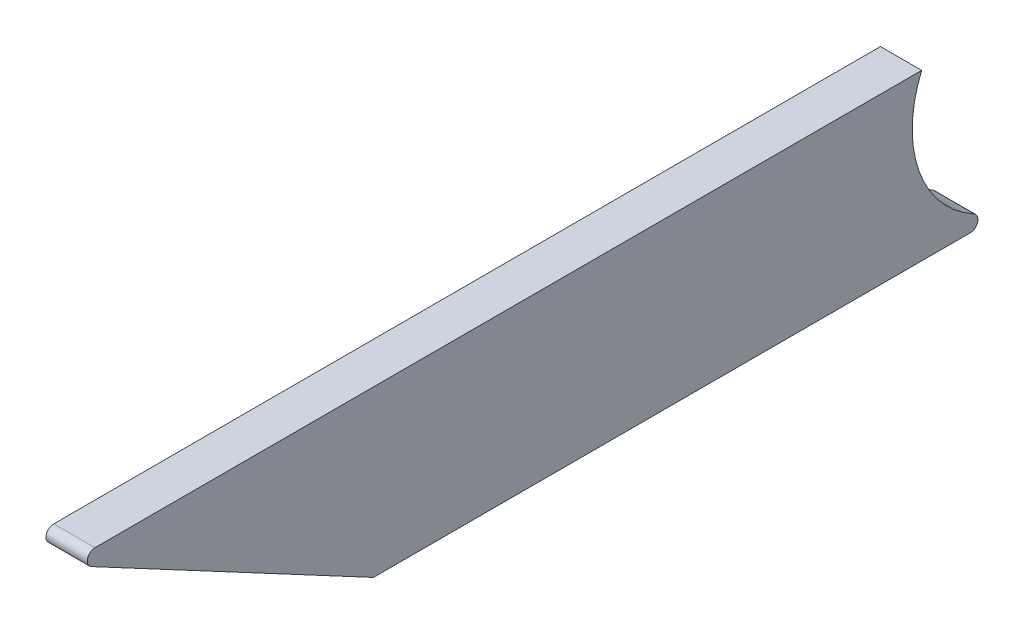
ISO-10303-21;
HEADER;
FILE_DESCRIPTION(('STEP AP214'),'2;1');
FILE_NAME('part.step','',(''),(''),'','','');
FILE_SCHEMA(('AUTOMOTIVE_DESIGN { 1 0 10303 214 1 1 1 1 }'));
ENDSEC;
DATA;
#1=APPLICATION_CONTEXT('core data for automotive mechanical design processes');
#2=APPLICATION_PROTOCOL_DEFINITION('international standard','automotive_design',2000,#1);
#3=PRODUCT_CONTEXT('',#1,'mechanical');
#4=PRODUCT('Part','Part','',(#3));
#5=PRODUCT_RELATED_PRODUCT_CATEGORY('part','',(#4));
#6=PRODUCT_DEFINITION_FORMATION('','',#4);
#7=PRODUCT_DEFINITION_CONTEXT('part definition',#1,'design');
#8=PRODUCT_DEFINITION('design','',#6,#7);
#9=PRODUCT_DEFINITION_SHAPE('','',#8);
#10=(LENGTH_UNIT() NAMED_UNIT(*) SI_UNIT(.MILLI.,.METRE.));
#11=(NAMED_UNIT(*) PLANE_ANGLE_UNIT() SI_UNIT($,.RADIAN.));
#12=(NAMED_UNIT(*) SI_UNIT($,.STERADIAN.) SOLID_ANGLE_UNIT());
#13=UNCERTAINTY_MEASURE_WITH_UNIT(LENGTH_MEASURE(1.E-05),#10,'distance_accuracy_value','');
#14=(GEOMETRIC_REPRESENTATION_CONTEXT(3) GLOBAL_UNCERTAINTY_ASSIGNED_CONTEXT((#13)) GLOBAL_UNIT_ASSIGNED_CONTEXT((#10,
#11,#12)) REPRESENTATION_CONTEXT('',''));
#15=CARTESIAN_POINT('',(0.,0.,0.));
#16=DIRECTION('',(0.,0.,1.));
#17=DIRECTION('',(1.,0.,0.));
#18=AXIS2_PLACEMENT_3D('',#15,#16,#17);
#19=CARTESIAN_POINT('',(16.,-46.0000000000006,0.));
#20=DIRECTION('',(0.,1.,0.));
#21=DIRECTION('',(0.,0.,1.));
#22=AXIS2_PLACEMENT_3D('',#19,#20,#21);
#23=PLANE('',#22);
#24=DIRECTION('',(0.,0.,-1.));
#25=VECTOR('',#24,1.);
#26=CARTESIAN_POINT('',(0.,-45.9999999999998,0.));
#27=LINE('',#26,#25);
#28=CARTESIAN_POINT('',(0.,-45.9999999999999,255.000000000002));
#29=VERTEX_POINT('',#28);
#30=CARTESIAN_POINT('',(-4.44089209850063E-13,-45.9999999999998,23.4946802489415));
#31=VERTEX_POINT('',#30);
#32=EDGE_CURVE('E112',#29,#31,#27,.T.);
#33=ORIENTED_EDGE('',*,*,#32,.T.);
#34=DIRECTION('',(-1.,0.,0.));
#35=VECTOR('',#34,1.);
#36=CARTESIAN_POINT('',(15.9999999999996,-46.0000000000006,23.4946802489415));
#37=LINE('',#36,#35);
#38=CARTESIAN_POINT('',(15.9999999999996,-46.0000000000006,23.4946802489415));
#39=VERTEX_POINT('',#38);
#40=EDGE_CURVE('E127',#31,#39,#37,.F.);
#41=ORIENTED_EDGE('',*,*,#40,.T.);
#42=DIRECTION('',(0.,0.,-1.));
#43=VECTOR('',#42,1.);
#44=CARTESIAN_POINT('',(16.,-46.0000000000006,0.));
#45=LINE('',#44,#43);
#46=CARTESIAN_POINT('',(16.,-46.0000000000008,255.000000000002));
#47=VERTEX_POINT('',#46);
#48=EDGE_CURVE('E95',#47,#39,#45,.T.);
#49=ORIENTED_EDGE('',*,*,#48,.F.);
#50=DIRECTION('',(-1.,0.,0.));
#51=VECTOR('',#50,1.);
#52=CARTESIAN_POINT('',(16.,-46.0000000000008,255.000000000002));
#53=LINE('',#52,#51);
#54=EDGE_CURVE('E104',#47,#29,#53,.T.);
#55=ORIENTED_EDGE('',*,*,#54,.T.);
#56=EDGE_LOOP('',(#33,#41,#49,#55));
#57=FACE_BOUND('',#56,.T.);
#58=ADVANCED_FACE('F34',(#57),#23,.F.);
#59=CARTESIAN_POINT('',(16.,-7.63278329429795E-13,0.));
#60=DIRECTION('',(-1.,0.,0.));
#61=DIRECTION('',(0.,0.,1.));
#62=AXIS2_PLACEMENT_3D('',#59,#60,#61);
#63=CYLINDRICAL_SURFACE('',#62,46.);
#64=CARTESIAN_POINT('',(16.,-7.63278329429795E-13,0.));
#65=DIRECTION('',(-1.,0.,0.));
#66=DIRECTION('',(0.,0.,-1.));
#67=AXIS2_PLACEMENT_3D('',#64,#65,#66);
#68=CIRCLE('',#67,46.);
#69=CARTESIAN_POINT('',(15.9999999999996,-40.3673469387763,22.0562304377818));
#70=VERTEX_POINT('',#69);
#71=CARTESIAN_POINT('',(16.,17.9999999999993,42.3320209770335));
#72=VERTEX_POINT('',#71);
#73=EDGE_CURVE('E85',#70,#72,#68,.T.);
#74=ORIENTED_EDGE('',*,*,#73,.F.);
#75=DIRECTION('',(-1.,0.,0.));
#76=VECTOR('',#75,1.);
#77=CARTESIAN_POINT('',(15.9999999999996,-40.3673469387763,22.0562304377818));
#78=LINE('',#77,#76);
#79=CARTESIAN_POINT('',(-4.44089209850063E-13,-40.3673469387754,22.0562304377818));
#80=VERTEX_POINT('',#79);
#81=EDGE_CURVE('E103',#70,#80,#78,.T.);
#82=ORIENTED_EDGE('',*,*,#81,.T.);
#83=CARTESIAN_POINT('',(0.,0.,0.));
#84=DIRECTION('',(-1.,0.,0.));
#85=DIRECTION('',(0.,0.,-1.));
#86=AXIS2_PLACEMENT_3D('',#83,#84,#85);
#87=CIRCLE('',#86,46.);
#88=CARTESIAN_POINT('',(0.,18.,42.3320209770335));
#89=VERTEX_POINT('',#88);
#90=EDGE_CURVE('E101',#80,#89,#87,.T.);
#91=ORIENTED_EDGE('',*,*,#90,.T.);
#92=DIRECTION('',(-1.,0.,0.));
#93=VECTOR('',#92,1.);
#94=CARTESIAN_POINT('',(16.,17.9999999999993,42.3320209770335));
#95=LINE('',#94,#93);
#96=EDGE_CURVE('E98',#72,#89,#95,.T.);
#97=ORIENTED_EDGE('',*,*,#96,.F.);
#98=EDGE_LOOP('',(#74,#82,#91,#97));
#99=FACE_BOUND('',#98,.T.);
#100=ADVANCED_FACE('F99',(#99),#63,.F.);
#101=CARTESIAN_POINT('',(16.,17.9999999999991,375.));
#102=DIRECTION('',(0.,-1.,0.));
#103=DIRECTION('',(0.,0.,-1.));
#104=AXIS2_PLACEMENT_3D('',#101,#102,#103);
#105=PLANE('',#104);
#106=DIRECTION('',(0.,0.,1.));
#107=VECTOR('',#106,1.);
#108=CARTESIAN_POINT('',(0.,18.,375.));
#109=LINE('',#108,#107);
#110=CARTESIAN_POINT('',(0.,18.0000000000001,363.));
#111=VERTEX_POINT('',#110);
#112=EDGE_CURVE('E116',#89,#111,#109,.T.);
#113=ORIENTED_EDGE('',*,*,#112,.T.);
#114=DIRECTION('',(-1.,0.,0.));
#115=VECTOR('',#114,1.);
#116=CARTESIAN_POINT('',(15.9999999999997,17.9999999999993,363.));
#117=LINE('',#116,#115);
#118=CARTESIAN_POINT('',(15.9999999999997,17.9999999999993,363.));
#119=VERTEX_POINT('',#118);
#120=EDGE_CURVE('E11',#111,#119,#117,.F.);
#121=ORIENTED_EDGE('',*,*,#120,.T.);
#122=DIRECTION('',(0.,0.,1.));
#123=VECTOR('',#122,1.);
#124=CARTESIAN_POINT('',(16.,17.9999999999991,375.));
#125=LINE('',#124,#123);
#126=EDGE_CURVE('E89',#72,#119,#125,.T.);
#127=ORIENTED_EDGE('',*,*,#126,.F.);
#128=ORIENTED_EDGE('',*,*,#96,.T.);
#129=EDGE_LOOP('',(#113,#121,#127,#128));
#130=FACE_BOUND('',#129,.T.);
#131=ADVANCED_FACE('F106',(#130),#105,.F.);
#132=CARTESIAN_POINT('',(16.,17.9999999999991,375.));
#133=DIRECTION('',(0.,0.88235294117647,-0.470588235294118));
#134=DIRECTION('',(0.,0.470588235294118,0.88235294117647));
#135=AXIS2_PLACEMENT_3D('',#132,#133,#134);
#136=PLANE('',#135);
#137=DIRECTION('',(0.,-0.470588235294118,-0.882352941176471));
#138=VECTOR('',#137,1.);
#139=CARTESIAN_POINT('',(16.,17.9999999999991,375.));
#140=LINE('',#139,#138);
#141=CARTESIAN_POINT('',(15.9999999999988,12.3529411764699,364.411764705884));
#142=VERTEX_POINT('',#141);
#143=EDGE_CURVE('E107',#142,#47,#140,.T.);
#144=ORIENTED_EDGE('',*,*,#143,.F.);
#145=DIRECTION('',(-1.,0.,0.));
#146=VECTOR('',#145,1.);
#147=CARTESIAN_POINT('',(15.9999999999988,12.3529411764699,364.411764705884));
#148=LINE('',#147,#146);
#149=CARTESIAN_POINT('',(-8.88178419700125E-13,12.3529411764707,364.411764705884));
#150=VERTEX_POINT('',#149);
#151=EDGE_CURVE('E42',#142,#150,#148,.T.);
#152=ORIENTED_EDGE('',*,*,#151,.T.);
#153=DIRECTION('',(0.,-0.470588235294118,-0.882352941176471));
#154=VECTOR('',#153,1.);
#155=CARTESIAN_POINT('',(0.,18.,375.));
#156=LINE('',#155,#154);
#157=EDGE_CURVE('E118',#150,#29,#156,.T.);
#158=ORIENTED_EDGE('',*,*,#157,.T.);
#159=ORIENTED_EDGE('',*,*,#54,.F.);
#160=EDGE_LOOP('',(#144,#152,#158,#159));
#161=FACE_BOUND('',#160,.T.);
#162=ADVANCED_FACE('F134',(#161),#136,.F.);
#163=CARTESIAN_POINT('',(16.,-7.63278329429795E-13,0.));
#164=DIRECTION('',(1.,0.,0.));
#165=DIRECTION('',(0.,0.,-1.));
#166=AXIS2_PLACEMENT_3D('',#163,#164,#165);
#167=PLANE('',#166);
#168=ORIENTED_EDGE('',*,*,#48,.T.);
#169=CARTESIAN_POINT('',(15.9999999999996,-43.0000000000007,23.4946802489415));
#170=DIRECTION('',(1.,0.,0.));
#171=DIRECTION('',(0.,0.,-1.));
#172=AXIS2_PLACEMENT_3D('',#169,#170,#171);
#173=CIRCLE('',#172,3.);
#174=EDGE_CURVE('E91',#39,#70,#173,.T.);
#175=ORIENTED_EDGE('',*,*,#174,.T.);
#176=ORIENTED_EDGE('',*,*,#73,.T.);
#177=ORIENTED_EDGE('',*,*,#126,.T.);
#178=CARTESIAN_POINT('',(15.9999999999988,14.9999999999994,363.000000000002));
#179=DIRECTION('',(1.,0.,0.));
#180=DIRECTION('',(0.,0.,-1.));
#181=AXIS2_PLACEMENT_3D('',#178,#179,#180);
#182=CIRCLE('',#181,3.);
#183=EDGE_CURVE('E49',#119,#142,#182,.T.);
#184=ORIENTED_EDGE('',*,*,#183,.T.);
#185=ORIENTED_EDGE('',*,*,#143,.T.);
#186=EDGE_LOOP('',(#168,#175,#176,#177,#184,#185));
#187=FACE_BOUND('',#186,.T.);
#188=ADVANCED_FACE('F88',(#187),#167,.T.);
#189=CARTESIAN_POINT('',(0.,0.,0.));
#190=DIRECTION('',(1.,0.,0.));
#191=DIRECTION('',(0.,0.,-1.));
#192=AXIS2_PLACEMENT_3D('',#189,#190,#191);
#193=PLANE('',#192);
#194=ORIENTED_EDGE('',*,*,#90,.F.);
#195=CARTESIAN_POINT('',(-4.44089209850063E-13,-42.9999999999999,23.4946802489415));
#196=DIRECTION('',(1.,0.,0.));
#197=DIRECTION('',(0.,0.,-1.));
#198=AXIS2_PLACEMENT_3D('',#195,#196,#197);
#199=CIRCLE('',#198,3.);
#200=EDGE_CURVE('E125',#80,#31,#199,.F.);
#201=ORIENTED_EDGE('',*,*,#200,.T.);
#202=ORIENTED_EDGE('',*,*,#32,.F.);
#203=ORIENTED_EDGE('',*,*,#157,.F.);
#204=CARTESIAN_POINT('',(-8.88178419700125E-13,15.0000000000001,363.000000000002));
#205=DIRECTION('',(1.,0.,0.));
#206=DIRECTION('',(0.,0.,-1.));
#207=AXIS2_PLACEMENT_3D('',#204,#205,#206);
#208=CIRCLE('',#207,3.);
#209=EDGE_CURVE('E123',#150,#111,#208,.F.);
#210=ORIENTED_EDGE('',*,*,#209,.T.);
#211=ORIENTED_EDGE('',*,*,#112,.F.);
#212=EDGE_LOOP('',(#194,#201,#202,#203,#210,#211));
#213=FACE_BOUND('',#212,.T.);
#214=ADVANCED_FACE('F139',(#213),#193,.F.);
#215=CARTESIAN_POINT('',(15.9999999999996,-43.0000000000007,23.4946802489415));
#216=DIRECTION('',(-1.,0.,0.));
#217=DIRECTION('',(0.,0.,1.));
#218=AXIS2_PLACEMENT_3D('',#215,#216,#217);
#219=CYLINDRICAL_SURFACE('',#218,3.);
#220=ORIENTED_EDGE('',*,*,#174,.F.);
#221=ORIENTED_EDGE('',*,*,#40,.F.);
#222=ORIENTED_EDGE('',*,*,#200,.F.);
#223=ORIENTED_EDGE('',*,*,#81,.F.);
#224=EDGE_LOOP('',(#220,#221,#222,#223));
#225=FACE_BOUND('',#224,.T.);
#226=ADVANCED_FACE('F144',(#225),#219,.T.);
#227=CARTESIAN_POINT('',(15.9999999999988,14.9999999999994,363.000000000002));
#228=DIRECTION('',(-1.,0.,0.));
#229=DIRECTION('',(0.,0.,1.));
#230=AXIS2_PLACEMENT_3D('',#227,#228,#229);
#231=CYLINDRICAL_SURFACE('',#230,3.);
#232=ORIENTED_EDGE('',*,*,#183,.F.);
#233=ORIENTED_EDGE('',*,*,#120,.F.);
#234=ORIENTED_EDGE('',*,*,#209,.F.);
#235=ORIENTED_EDGE('',*,*,#151,.F.);
#236=EDGE_LOOP('',(#232,#233,#234,#235));
#237=FACE_BOUND('',#236,.T.);
#238=ADVANCED_FACE('F36',(#237),#231,.T.);
#239=CLOSED_SHELL('',(#58,#100,#131,#162,#188,#214,#226,#238));
#240=MANIFOLD_SOLID_BREP('B2',#239);
#241=ADVANCED_BREP_SHAPE_REPRESENTATION('',(#18,#240),#14);
#242=SHAPE_DEFINITION_REPRESENTATION(#9,#241);
ENDSEC;
END-ISO-10303-21;
